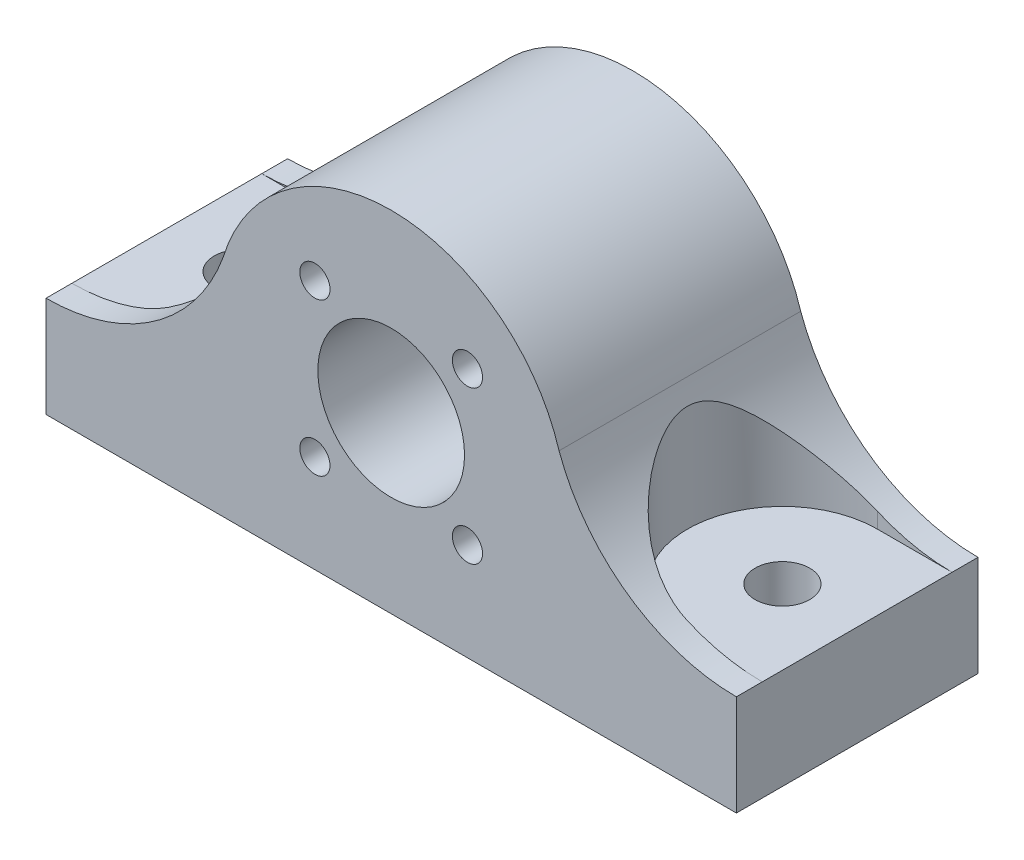
ISO-10303-21;
HEADER;
FILE_DESCRIPTION(('STEP AP214'),'2;1');
FILE_NAME('part.step','',(''),(''),'','','');
FILE_SCHEMA(('AUTOMOTIVE_DESIGN { 1 0 10303 214 1 1 1 1 }'));
ENDSEC;
DATA;
#1=APPLICATION_CONTEXT('core data for automotive mechanical design processes');
#2=APPLICATION_PROTOCOL_DEFINITION('international standard','automotive_design',2000,#1);
#3=PRODUCT_CONTEXT('',#1,'mechanical');
#4=PRODUCT('Part','Part','',(#3));
#5=PRODUCT_RELATED_PRODUCT_CATEGORY('part','',(#4));
#6=PRODUCT_DEFINITION_FORMATION('','',#4);
#7=PRODUCT_DEFINITION_CONTEXT('part definition',#1,'design');
#8=PRODUCT_DEFINITION('design','',#6,#7);
#9=PRODUCT_DEFINITION_SHAPE('','',#8);
#10=(LENGTH_UNIT() NAMED_UNIT(*) SI_UNIT(.MILLI.,.METRE.));
#11=(NAMED_UNIT(*) PLANE_ANGLE_UNIT() SI_UNIT($,.RADIAN.));
#12=(NAMED_UNIT(*) SI_UNIT($,.STERADIAN.) SOLID_ANGLE_UNIT());
#13=UNCERTAINTY_MEASURE_WITH_UNIT(LENGTH_MEASURE(1.E-05),#10,'distance_accuracy_value','');
#14=(GEOMETRIC_REPRESENTATION_CONTEXT(3) GLOBAL_UNCERTAINTY_ASSIGNED_CONTEXT((#13)) GLOBAL_UNIT_ASSIGNED_CONTEXT((#10,
#11,#12)) REPRESENTATION_CONTEXT('',''));
#15=CARTESIAN_POINT('',(0.,0.,0.));
#16=DIRECTION('',(0.,0.,1.));
#17=DIRECTION('',(1.,0.,0.));
#18=AXIS2_PLACEMENT_3D('',#15,#16,#17);
#19=CARTESIAN_POINT('',(24.,13.1098300768287,16.8));
#20=DIRECTION('',(0.,0.,-1.));
#21=DIRECTION('',(-1.,0.,0.));
#22=AXIS2_PLACEMENT_3D('',#19,#20,#21);
#23=CYLINDRICAL_SURFACE('',#22,13.1098300768287);
#24=CARTESIAN_POINT('',(24.,13.1098300768287,1.8));
#25=DIRECTION('',(0.,0.,1.));
#26=DIRECTION('',(1.,0.,0.));
#27=AXIS2_PLACEMENT_3D('',#24,#25,#26);
#28=CIRCLE('',#27,13.1098300768287);
#29=CARTESIAN_POINT('',(24.,0.,1.8));
#30=VERTEX_POINT('',#29);
#31=CARTESIAN_POINT('',(18.8,1.07539429265824,1.8));
#32=VERTEX_POINT('',#31);
#33=EDGE_CURVE('E11',#30,#32,#28,.F.);
#34=ORIENTED_EDGE('',*,*,#33,.F.);
#35=DIRECTION('',(0.,0.,-1.));
#36=VECTOR('',#35,1.);
#37=CARTESIAN_POINT('',(24.,0.,16.8));
#38=LINE('',#37,#36);
#39=CARTESIAN_POINT('',(24.,0.,0.));
#40=VERTEX_POINT('',#39);
#41=EDGE_CURVE('E143',#30,#40,#38,.T.);
#42=ORIENTED_EDGE('',*,*,#41,.T.);
#43=CARTESIAN_POINT('',(24.,13.1098300768287,0.));
#44=DIRECTION('',(0.,0.,-1.));
#45=DIRECTION('',(-1.,0.,0.));
#46=AXIS2_PLACEMENT_3D('',#43,#44,#45);
#47=CIRCLE('',#46,13.1098300768287);
#48=CARTESIAN_POINT('',(11.6720820764763,8.65,0.));
#49=VERTEX_POINT('',#48);
#50=EDGE_CURVE('E336',#40,#49,#47,.T.);
#51=ORIENTED_EDGE('',*,*,#50,.T.);
#52=DIRECTION('',(0.,0.,-1.));
#53=VECTOR('',#52,1.);
#54=CARTESIAN_POINT('',(11.6720820764763,8.65,16.8));
#55=LINE('',#54,#53);
#56=CARTESIAN_POINT('',(11.6720820764763,8.65,16.8));
#57=VERTEX_POINT('',#56);
#58=EDGE_CURVE('E171',#57,#49,#55,.T.);
#59=ORIENTED_EDGE('',*,*,#58,.F.);
#60=CARTESIAN_POINT('',(24.,13.1098300768287,16.8));
#61=DIRECTION('',(0.,0.,-1.));
#62=DIRECTION('',(-1.,0.,0.));
#63=AXIS2_PLACEMENT_3D('',#60,#61,#62);
#64=CIRCLE('',#63,13.1098300768287);
#65=CARTESIAN_POINT('',(24.,0.,16.8));
#66=VERTEX_POINT('',#65);
#67=EDGE_CURVE('E339',#66,#57,#64,.T.);
#68=ORIENTED_EDGE('',*,*,#67,.F.);
#69=CARTESIAN_POINT('',(24.,0.,15.));
#70=VERTEX_POINT('',#69);
#71=EDGE_CURVE('E151',#66,#70,#38,.T.);
#72=ORIENTED_EDGE('',*,*,#71,.T.);
#73=CARTESIAN_POINT('',(24.,13.1098300768287,15.));
#74=DIRECTION('',(0.,0.,-1.));
#75=DIRECTION('',(-1.,0.,0.));
#76=AXIS2_PLACEMENT_3D('',#73,#74,#75);
#77=CIRCLE('',#76,13.1098300768287);
#78=CARTESIAN_POINT('',(18.8,1.07539429265824,15.));
#79=VERTEX_POINT('',#78);
#80=EDGE_CURVE('E258',#79,#70,#77,.F.);
#81=ORIENTED_EDGE('',*,*,#80,.F.);
#82=CARTESIAN_POINT('',(24.,0.,4.33551971341969));
#83=CARTESIAN_POINT('',(23.8919678579725,-1.54419120571519E-06,4.19727136892321));
#84=CARTESIAN_POINT('',(23.7783821198537,0.00133496363836336,4.0633464538159));
#85=CARTESIAN_POINT('',(23.5409350716157,0.00750205246568845,3.80497546751053));
#86=CARTESIAN_POINT('',(23.4170715750358,0.0123333786368567,3.68053142410222));
#87=CARTESIAN_POINT('',(23.1599009828539,0.0263112967807585,3.44197077370692));
#88=CARTESIAN_POINT('',(23.0265904905904,0.035459447623843,3.32785791522285));
#89=CARTESIAN_POINT('',(22.7515968409265,0.0588466022616071,3.11080761608302));
#90=CARTESIAN_POINT('',(22.6099144882146,0.0730851174417469,3.00786910405855));
#91=CARTESIAN_POINT('',(22.3189880459794,0.107394192566268,2.81364339589038));
#92=CARTESIAN_POINT('',(22.1697280914674,0.127477443356168,2.72238218247385));
#93=CARTESIAN_POINT('',(21.8652115087728,0.174064055512228,2.55236066892208));
#94=CARTESIAN_POINT('',(21.7099550229094,0.200567264588346,2.47360007232876));
#95=CARTESIAN_POINT('',(21.3949908563303,0.260423983901539,2.32908477377368));
#96=CARTESIAN_POINT('',(21.2352882333197,0.293769964899572,2.26331593151566));
#97=CARTESIAN_POINT('',(20.912706732767,0.367630943318746,2.14492302379764));
#98=CARTESIAN_POINT('',(20.7498279517736,0.408145723124559,2.09229855944513));
#99=CARTESIAN_POINT('',(20.426927825459,0.49523628311991,2.00152811505207));
#100=CARTESIAN_POINT('',(20.2669541958683,0.541610555855526,1.96301794539534));
#101=CARTESIAN_POINT('',(19.9466623814907,0.641220490085528,1.89831873930515));
#102=CARTESIAN_POINT('',(19.7863442036258,0.694456014980988,1.8721294576265));
#103=CARTESIAN_POINT('',(19.466513779999,0.807637811797313,1.83176194008686));
#104=CARTESIAN_POINT('',(19.3070018337271,0.867586409777519,1.81758788213396));
#105=CARTESIAN_POINT('',(18.9898727453009,0.993914214771304,1.80082018715825));
#106=CARTESIAN_POINT('',(18.8322563313994,1.06029580983596,1.79823086756499));
#107=CARTESIAN_POINT('',(18.5129129951867,1.20221049391793,1.80422729585653));
#108=CARTESIAN_POINT('',(18.3513190266952,1.27802058255163,1.81331975096274));
#109=CARTESIAN_POINT('',(18.032144125916,1.43575413240055,1.84285895888905));
#110=CARTESIAN_POINT('',(17.8745648103248,1.51768000582941,1.86331021259557));
#111=CARTESIAN_POINT('',(17.5642091599574,1.68706804275672,1.91481964206346));
#112=CARTESIAN_POINT('',(17.4114326525692,1.77453000694782,1.94587743615061));
#113=CARTESIAN_POINT('',(17.1112131047088,1.95443204289707,2.01785009601203));
#114=CARTESIAN_POINT('',(16.963771138137,2.04687310778242,2.0587669339582));
#115=CARTESIAN_POINT('',(16.6107327185307,2.27800578907204,2.16984234650978));
#116=CARTESIAN_POINT('',(16.4082314214901,2.41908315275578,2.24493261105059));
#117=CARTESIAN_POINT('',(16.0159883683902,2.70873854478921,2.41211473145636));
#118=CARTESIAN_POINT('',(15.8262514537032,2.85731938212334,2.50421298919359));
#119=CARTESIAN_POINT('',(15.4595901994709,3.16067030632686,2.70391897380273));
#120=CARTESIAN_POINT('',(15.2826948977154,3.315453262745,2.81156030026097));
#121=CARTESIAN_POINT('',(14.9423653546212,3.62929844647699,3.04082517795332));
#122=CARTESIAN_POINT('',(14.7789294853709,3.78836015318171,3.16244703397366));
#123=CARTESIAN_POINT('',(14.462764069721,4.11200598838441,3.42096223270564));
#124=CARTESIAN_POINT('',(14.3102722719071,4.2766380456356,3.55808580474619));
#125=CARTESIAN_POINT('',(14.0191652553494,4.60694554556832,3.84528333918408));
#126=CARTESIAN_POINT('',(13.8805529601696,4.77262120029323,3.99536001766645));
#127=CARTESIAN_POINT('',(13.6175345153183,5.10255481773947,4.30808989117175));
#128=CARTESIAN_POINT('',(13.4931005646782,5.26681494999416,4.47071738774469));
#129=CARTESIAN_POINT('',(13.2583865058315,5.59148859362617,4.80932468585732));
#130=CARTESIAN_POINT('',(13.1480991873502,5.75190403039788,4.98529761211785));
#131=CARTESIAN_POINT('',(12.9396009949646,6.06908552921575,5.35660801400765));
#132=CARTESIAN_POINT('',(12.8417596294292,6.225660980636,5.55231881864511));
#133=CARTESIAN_POINT('',(12.6627790991701,6.52459678331459,5.96186841163216));
#134=CARTESIAN_POINT('',(12.581641630024,6.66695569072676,6.17570903719461));
#135=CARTESIAN_POINT('',(12.4509540851328,6.9047986515647,6.58672697198489));
#136=CARTESIAN_POINT('',(12.3983863306009,7.00413950765111,6.78065518777775));
#137=CARTESIAN_POINT('',(12.3097775865062,7.17554763702746,7.18375596870057));
#138=CARTESIAN_POINT('',(12.273688832287,7.24769362763432,7.39288241254132));
#139=CARTESIAN_POINT('',(12.2281167756389,7.33987234591703,7.76998485317434));
#140=CARTESIAN_POINT('',(12.214255170523,7.36839143320737,7.93530582038945));
#141=CARTESIAN_POINT('',(12.1991973493075,7.39939741262399,8.26890418078606));
#142=CARTESIAN_POINT('',(12.1979881710609,7.40191094686658,8.43717837132612));
#143=CARTESIAN_POINT('',(12.2083357562146,7.38057175603785,8.77136983438056));
#144=CARTESIAN_POINT('',(12.2198774386231,7.35675017861418,8.93728965664949));
#145=CARTESIAN_POINT('',(12.2545978269363,7.28619781377521,9.26292487433375));
#146=CARTESIAN_POINT('',(12.2777935107874,7.23943360509798,9.42263085040844));
#147=CARTESIAN_POINT('',(12.3507105959016,7.09557576425532,9.82458553132353));
#148=CARTESIAN_POINT('',(12.4080121368051,6.98503783470272,10.0605979130179));
#149=CARTESIAN_POINT('',(12.5087957869682,6.79912737652016,10.3986711415181));
#150=CARTESIAN_POINT('',(12.5449583930853,6.7336399889594,10.5089298815429));
#151=CARTESIAN_POINT('',(12.6218436305865,6.59743417695687,10.7245324333388));
#152=CARTESIAN_POINT('',(12.6625652797075,6.52671688042909,10.8298772969207));
#153=CARTESIAN_POINT('',(12.7857728623214,6.31764822660199,11.1263589045584));
#154=CARTESIAN_POINT('',(12.8735854045131,6.1743353756479,11.3117765333973));
#155=CARTESIAN_POINT('',(13.0627887123436,5.87962706703347,11.6688246678923));
#156=CARTESIAN_POINT('',(13.1641907291987,5.72822497513586,11.8404435586538));
#157=CARTESIAN_POINT('',(13.3800614839052,5.42088556827216,12.1713829015469));
#158=CARTESIAN_POINT('',(13.4945464523393,5.26494280280095,12.3306876572206));
#159=CARTESIAN_POINT('',(13.7361759294436,4.95135252396875,12.6374260594472));
#160=CARTESIAN_POINT('',(13.8633167147388,4.7937055240935,12.7848631745396));
#161=CARTESIAN_POINT('',(14.1410718780176,4.46581357816768,13.0795999336553));
#162=CARTESIAN_POINT('',(14.2927541818074,4.29558587775522,13.2259148851044));
#163=CARTESIAN_POINT('',(14.6109186774136,3.95741436602203,13.5045379878621));
#164=CARTESIAN_POINT('',(14.7774034718958,3.78947096234946,13.6368436669783));
#165=CARTESIAN_POINT('',(15.1248880447335,3.45801150016563,13.886275479253));
#166=CARTESIAN_POINT('',(15.3058652194449,3.29448905939364,14.0034245332972));
#167=CARTESIAN_POINT('',(15.6824016724741,2.97344146368716,14.2213286509662));
#168=CARTESIAN_POINT('',(15.8779568686112,2.8159146483648,14.3220882790466));
#169=CARTESIAN_POINT('',(16.2414372931092,2.54038818925504,14.4864531231355));
#170=CARTESIAN_POINT('',(16.4067410331015,2.42093779786057,14.5534350972045));
#171=CARTESIAN_POINT('',(16.7458962076883,2.18792881002065,14.6747974598849));
#172=CARTESIAN_POINT('',(16.9197459287343,2.07436904175997,14.7291803623346));
#173=CARTESIAN_POINT('',(17.2752799502428,1.85418822049595,14.8240996571317));
#174=CARTESIAN_POINT('',(17.4569584921594,1.74756220742406,14.8646460376437));
#175=CARTESIAN_POINT('',(17.8273690627669,1.54215566871015,14.9306477694618));
#176=CARTESIAN_POINT('',(18.0161000692684,1.44337401253753,14.9561052988075));
#177=CARTESIAN_POINT('',(18.3708163874544,1.26867299165842,14.9880663511403));
#178=CARTESIAN_POINT('',(18.5360020238465,1.19153995509184,14.9968284198118));
#179=CARTESIAN_POINT('',(18.8695991342095,1.04418199491221,15.0017400288873));
#180=CARTESIAN_POINT('',(19.0380100168163,0.973955819111043,14.9978918598379));
#181=CARTESIAN_POINT('',(19.3768457346043,0.84087718266649,14.9769330008779));
#182=CARTESIAN_POINT('',(19.5472697651762,0.778021878957732,14.9598274440581));
#183=CARTESIAN_POINT('',(19.8888496624852,0.659981184908422,14.911846719861));
#184=CARTESIAN_POINT('',(20.0600055366552,0.604795872660494,14.8809714122995));
#185=CARTESIAN_POINT('',(20.4021755025314,0.50208139446981,14.8049868402637));
#186=CARTESIAN_POINT('',(20.5731867940951,0.454580922638591,14.759826008898));
#187=CARTESIAN_POINT('',(20.9128345490924,0.367467913570072,14.6551982923236));
#188=CARTESIAN_POINT('',(21.0814709716393,0.327855511983147,14.5957311611296));
#189=CARTESIAN_POINT('',(21.4148100289309,0.256289125899758,14.4625897830849));
#190=CARTESIAN_POINT('',(21.5795107408356,0.224338818616978,14.3889087451422));
#191=CARTESIAN_POINT('',(21.9032857481589,0.167711089132467,14.2277196009515));
#192=CARTESIAN_POINT('',(22.0623604790495,0.143033102936957,14.1402125677665));
#193=CARTESIAN_POINT('',(22.3633510128825,0.101732612304182,13.9580084830531));
#194=CARTESIAN_POINT('',(22.5057118595631,0.0846933171075692,13.8641387791883));
#195=CARTESIAN_POINT('',(22.7830794496132,0.0558578408058795,13.6653760376127));
#196=CARTESIAN_POINT('',(22.9180861906489,0.044061661364614,13.5604829964038));
#197=CARTESIAN_POINT('',(23.1795181814501,0.025044588624008,13.3405426933035));
#198=CARTESIAN_POINT('',(23.3059566478579,0.0178164986491267,13.2255117304001));
#199=CARTESIAN_POINT('',(23.5495558413798,0.00717383619441023,12.9859434482705));
#200=CARTESIAN_POINT('',(23.6667213801893,0.00375727370962314,12.8614111260411));
#201=CARTESIAN_POINT('',(23.8169061038591,0.00122333708919264,12.6888247007715));
#202=CARTESIAN_POINT('',(23.8543754616406,0.000756901480981962,12.6446024679814));
#203=CARTESIAN_POINT('',(23.9280944038036,0.000145477956769293,12.5552372596187));
#204=CARTESIAN_POINT('',(23.9643453610683,1.15422993604912E-07,12.5100954191735));
#205=CARTESIAN_POINT('',(24.,0.,12.4644802865803));
#206=B_SPLINE_CURVE_WITH_KNOTS('',3,(#82,#83,#84,#85,#86,#87,#88,#89,#90,#91,#92,#93,#94,#95,
#96,#97,#98,#99,#100,#101,#102,#103,#104,#105,#106,#107,#108,#109,#110,#111,#112,#113,#114,#115,
#116,#117,#118,#119,#120,#121,#122,#123,#124,#125,#126,#127,#128,#129,#130,#131,#132,#133,#134,
#135,#136,#137,#138,#139,#140,#141,#142,#143,#144,#145,#146,#147,#148,#149,#150,#151,#152,#153,
#154,#155,#156,#157,#158,#159,#160,#161,#162,#163,#164,#165,#166,#167,#168,#169,#170,#171,#172,
#173,#174,#175,#176,#177,#178,#179,#180,#181,#182,#183,#184,#185,#186,#187,#188,#189,#190,#191,
#192,#193,#194,#195,#196,#197,#198,#199,#200,#201,#202,#203,#204,#205),.UNSPECIFIED.,.F.,.F.,(4,
2,2,2,2,2,2,2,2,2,2,2,2,2,2,2,2,2,2,2,2,2,2,2,2,2,2,2,2,2,2,2,2,2,2,2,2,2,2,2,2,2,2,2,2,2,2,2,2,
2,2,2,2,2,2,2,2,2,2,2,2,4),(0.,0.526232805638167,1.05257784896305,1.5791131090298,
2.10559784152694,2.63323438540227,3.16085841425489,3.68790497117736,4.21493553187203,
4.72720696830762,5.23946820763621,5.75190749637536,6.26453774638274,6.8001728084799,
7.336020265779,7.87184844274664,8.40778389419974,9.18056261735872,9.95363281239707,
10.7283998982175,11.5030731382977,12.2913189884279,13.0797305261018,13.8665685250894,
14.6530038802843,15.4590405268195,16.2651589521531,16.9356584115313,17.6042018844253,
18.1069655130884,18.6092140204231,19.110869132178,19.6132572005721,20.4089074571561,
20.8084974267909,21.2080014683302,21.9576072361315,22.7078375085944,23.4590088257556,
24.2099597958408,25.0219320054885,25.8340472645263,26.644919663203,27.4555658457998,
28.0989943293821,28.7422943216752,29.3851289480353,30.0278707601383,30.5748677115066,
31.1217653108536,31.6684512641687,32.2151427832021,32.7638306740213,33.312527999758,
33.8614881332048,34.4104056816742,34.9239317043016,35.4374578898873,35.9501730241847,
36.4626203435813,36.6364959228367,36.8101685222338),.UNSPECIFIED.);
#207=EDGE_CURVE('E41',#32,#79,#206,.T.);
#208=ORIENTED_EDGE('',*,*,#207,.F.);
#209=EDGE_LOOP('',(#34,#42,#51,#59,#68,#72,#81,#208));
#210=FACE_BOUND('',#209,.T.);
#211=ADVANCED_FACE('F33',(#210),#23,.F.);
#212=CARTESIAN_POINT('',(-24.,13.1098300768287,16.8));
#213=DIRECTION('',(0.,0.,-1.));
#214=DIRECTION('',(-1.,0.,0.));
#215=AXIS2_PLACEMENT_3D('',#212,#213,#214);
#216=CYLINDRICAL_SURFACE('',#215,13.1098300768287);
#217=CARTESIAN_POINT('',(-24.,13.1098300768287,1.8));
#218=DIRECTION('',(0.,0.,1.));
#219=DIRECTION('',(1.,0.,0.));
#220=AXIS2_PLACEMENT_3D('',#217,#218,#219);
#221=CIRCLE('',#220,13.1098300768287);
#222=CARTESIAN_POINT('',(-18.8,1.07539429265824,1.8));
#223=VERTEX_POINT('',#222);
#224=CARTESIAN_POINT('',(-24.,0.,1.8));
#225=VERTEX_POINT('',#224);
#226=EDGE_CURVE('E253',#223,#225,#221,.F.);
#227=ORIENTED_EDGE('',*,*,#226,.F.);
#228=CARTESIAN_POINT('',(-24.,0.,12.4644802865803));
#229=CARTESIAN_POINT('',(-23.8919678579725,-1.54419120449682E-06,12.6027286310768));
#230=CARTESIAN_POINT('',(-23.7783821198537,0.00133496363836513,12.7366535461841));
#231=CARTESIAN_POINT('',(-23.5409350716157,0.00750205246569051,12.9950245324895));
#232=CARTESIAN_POINT('',(-23.4170715750358,0.0123333786368585,13.1194685758978));
#233=CARTESIAN_POINT('',(-23.1599009828539,0.0263112967807594,13.3580292262931));
#234=CARTESIAN_POINT('',(-23.0265904905904,0.0354594476238431,13.4721420847772));
#235=CARTESIAN_POINT('',(-22.7515968409265,0.0588466022616079,13.689192383917));
#236=CARTESIAN_POINT('',(-22.6099144882146,0.0730851174417491,13.7921308959415));
#237=CARTESIAN_POINT('',(-22.3189880459794,0.107394192566271,13.9863566041096));
#238=CARTESIAN_POINT('',(-22.1697280914674,0.127477443356171,14.0776178175262));
#239=CARTESIAN_POINT('',(-21.8652115087728,0.17406405551223,14.2476393310779));
#240=CARTESIAN_POINT('',(-21.7099550229094,0.200567264588348,14.3263999276712));
#241=CARTESIAN_POINT('',(-21.3949908563303,0.260423983901539,14.4709152262263));
#242=CARTESIAN_POINT('',(-21.2352882333197,0.293769964899572,14.5366840684843));
#243=CARTESIAN_POINT('',(-20.912706732767,0.367630943318745,14.6550769762024));
#244=CARTESIAN_POINT('',(-20.7498279517736,0.408145723124558,14.7077014405549));
#245=CARTESIAN_POINT('',(-20.426927825459,0.495236283119909,14.7984718849479));
#246=CARTESIAN_POINT('',(-20.2669541958683,0.541610555855525,14.8369820546047));
#247=CARTESIAN_POINT('',(-19.9466623814907,0.641220490085528,14.9016812606949));
#248=CARTESIAN_POINT('',(-19.7863442036258,0.694456014980988,14.9278705423735));
#249=CARTESIAN_POINT('',(-19.466513779999,0.807637811797314,14.9682380599131));
#250=CARTESIAN_POINT('',(-19.3070018337271,0.86758640977752,14.9824121178661));
#251=CARTESIAN_POINT('',(-18.9898727453009,0.993914214771306,14.9991798128418));
#252=CARTESIAN_POINT('',(-18.8322563313994,1.06029580983596,15.001769132435));
#253=CARTESIAN_POINT('',(-18.5129129951867,1.20221049391793,14.9957727041435));
#254=CARTESIAN_POINT('',(-18.3513190266952,1.27802058255163,14.9866802490373));
#255=CARTESIAN_POINT('',(-18.032144125916,1.43575413240055,14.957141041111));
#256=CARTESIAN_POINT('',(-17.8745648103248,1.51768000582941,14.9366897874044));
#257=CARTESIAN_POINT('',(-17.5642091599574,1.68706804275673,14.8851803579365));
#258=CARTESIAN_POINT('',(-17.4114326525692,1.77453000694782,14.8541225638494));
#259=CARTESIAN_POINT('',(-17.1112131047088,1.95443204289707,14.782149903988));
#260=CARTESIAN_POINT('',(-16.963771138137,2.04687310778242,14.7412330660418));
#261=CARTESIAN_POINT('',(-16.6107327185307,2.27800578907204,14.6301576534902));
#262=CARTESIAN_POINT('',(-16.4082314214901,2.41908315275578,14.5550673889494));
#263=CARTESIAN_POINT('',(-16.0159883683902,2.70873854478921,14.3878852685437));
#264=CARTESIAN_POINT('',(-15.8262514537032,2.85731938212334,14.2957870108064));
#265=CARTESIAN_POINT('',(-15.4595901994709,3.16067030632686,14.0960810261973));
#266=CARTESIAN_POINT('',(-15.2826948977154,3.315453262745,13.988439699739));
#267=CARTESIAN_POINT('',(-14.9423653546212,3.62929844647699,13.7591748220467));
#268=CARTESIAN_POINT('',(-14.7789294853709,3.78836015318171,13.6375529660263));
#269=CARTESIAN_POINT('',(-14.462764069721,4.11200598838441,13.3790377672944));
#270=CARTESIAN_POINT('',(-14.3102722719071,4.2766380456356,13.2419141952538));
#271=CARTESIAN_POINT('',(-14.0191652553495,4.60694554556832,12.9547166608159));
#272=CARTESIAN_POINT('',(-13.8805529601696,4.77262120029323,12.8046399823336));
#273=CARTESIAN_POINT('',(-13.6175345153183,5.10255481773947,12.4919101088283));
#274=CARTESIAN_POINT('',(-13.4931005646782,5.26681494999416,12.3292826122553));
#275=CARTESIAN_POINT('',(-13.2583865058315,5.59148859362617,11.9906753141427));
#276=CARTESIAN_POINT('',(-13.1480991873503,5.75190403039788,11.8147023878822));
#277=CARTESIAN_POINT('',(-12.9396009949646,6.06908552921575,11.4433919859924));
#278=CARTESIAN_POINT('',(-12.8417596294292,6.225660980636,11.2476811813549));
#279=CARTESIAN_POINT('',(-12.6627790991701,6.52459678331459,10.8381315883678));
#280=CARTESIAN_POINT('',(-12.581641630024,6.66695569072676,10.6242909628054));
#281=CARTESIAN_POINT('',(-12.4509540851328,6.90479865156469,10.2132730280151));
#282=CARTESIAN_POINT('',(-12.3983863306009,7.00413950765111,10.0193448122223));
#283=CARTESIAN_POINT('',(-12.3097775865062,7.17554763702746,9.61624403129943));
#284=CARTESIAN_POINT('',(-12.273688832287,7.24769362763432,9.40711758745868));
#285=CARTESIAN_POINT('',(-12.2281167756389,7.33987234591703,9.03001514682566));
#286=CARTESIAN_POINT('',(-12.214255170523,7.36839143320736,8.86469417961056));
#287=CARTESIAN_POINT('',(-12.1991973493075,7.39939741262398,8.53109581921395));
#288=CARTESIAN_POINT('',(-12.1979881710609,7.40191094686658,8.36282162867388));
#289=CARTESIAN_POINT('',(-12.2083357562146,7.38057175603785,8.02863016561945));
#290=CARTESIAN_POINT('',(-12.2198774386231,7.35675017861417,7.86271034335052));
#291=CARTESIAN_POINT('',(-12.2545978269363,7.28619781377521,7.53707512566626));
#292=CARTESIAN_POINT('',(-12.2777935107874,7.23943360509799,7.37736914959156));
#293=CARTESIAN_POINT('',(-12.3507105959016,7.09557576425532,6.97541446867648));
#294=CARTESIAN_POINT('',(-12.4080121368051,6.98503783470272,6.73940208698212));
#295=CARTESIAN_POINT('',(-12.5087957869682,6.79912737652016,6.40132885848187));
#296=CARTESIAN_POINT('',(-12.5449583930853,6.7336399889594,6.2910701184571));
#297=CARTESIAN_POINT('',(-12.6218436305865,6.59743417695687,6.07546756666123));
#298=CARTESIAN_POINT('',(-12.6625652797075,6.52671688042909,5.97012270307929));
#299=CARTESIAN_POINT('',(-12.7857728623214,6.31764822660199,5.67364109544156));
#300=CARTESIAN_POINT('',(-12.8735854045131,6.1743353756479,5.48822346660275));
#301=CARTESIAN_POINT('',(-13.0627887123436,5.87962706703347,5.13117533210769));
#302=CARTESIAN_POINT('',(-13.1641907291987,5.72822497513586,4.95955644134617));
#303=CARTESIAN_POINT('',(-13.3800614839052,5.42088556827216,4.62861709845306));
#304=CARTESIAN_POINT('',(-13.4945464523393,5.26494280280095,4.46931234277937));
#305=CARTESIAN_POINT('',(-13.7361759294436,4.95135252396875,4.16257394055278));
#306=CARTESIAN_POINT('',(-13.8633167147388,4.7937055240935,4.01513682546045));
#307=CARTESIAN_POINT('',(-14.1410718780176,4.46581357816767,3.72040006634468));
#308=CARTESIAN_POINT('',(-14.2927541818074,4.29558587775522,3.57408511489565));
#309=CARTESIAN_POINT('',(-14.6109186774136,3.95741436602203,3.29546201213793));
#310=CARTESIAN_POINT('',(-14.7774034718958,3.78947096234946,3.16315633302173));
#311=CARTESIAN_POINT('',(-15.1248880447335,3.45801150016563,2.913724520747));
#312=CARTESIAN_POINT('',(-15.3058652194449,3.29448905939364,2.79657546670278));
#313=CARTESIAN_POINT('',(-15.6824016724741,2.97344146368715,2.57867134903378));
#314=CARTESIAN_POINT('',(-15.8779568686112,2.81591464836479,2.47791172095344));
#315=CARTESIAN_POINT('',(-16.2414372931093,2.54038818925504,2.31354687686452));
#316=CARTESIAN_POINT('',(-16.4067410331015,2.42093779786057,2.24656490279548));
#317=CARTESIAN_POINT('',(-16.7458962076883,2.18792881002065,2.12520254011512));
#318=CARTESIAN_POINT('',(-16.9197459287343,2.07436904175996,2.07081963766539));
#319=CARTESIAN_POINT('',(-17.2752799502428,1.85418822049595,1.97590034286828));
#320=CARTESIAN_POINT('',(-17.4569584921594,1.74756220742406,1.93535396235629));
#321=CARTESIAN_POINT('',(-17.8273690627669,1.54215566871015,1.86935223053824));
#322=CARTESIAN_POINT('',(-18.0161000692684,1.44337401253753,1.84389470119251));
#323=CARTESIAN_POINT('',(-18.3708163874544,1.26867299165842,1.81193364885969));
#324=CARTESIAN_POINT('',(-18.5360020238465,1.19153995509184,1.80317158018819));
#325=CARTESIAN_POINT('',(-18.8695991342095,1.04418199491221,1.79825997111273));
#326=CARTESIAN_POINT('',(-19.0380100168163,0.973955819111045,1.80210814016207));
#327=CARTESIAN_POINT('',(-19.3768457346043,0.840877182666493,1.82306699912213));
#328=CARTESIAN_POINT('',(-19.5472697651762,0.778021878957736,1.84017255594194));
#329=CARTESIAN_POINT('',(-19.8888496624852,0.659981184908424,1.88815328013897));
#330=CARTESIAN_POINT('',(-20.0600055366552,0.604795872660493,1.91902858770052));
#331=CARTESIAN_POINT('',(-20.4021755025314,0.502081394469806,1.99501315973626));
#332=CARTESIAN_POINT('',(-20.5731867940951,0.454580922638589,2.04017399110197));
#333=CARTESIAN_POINT('',(-20.9128345490924,0.367467913570072,2.14480170767643));
#334=CARTESIAN_POINT('',(-21.0814709716393,0.327855511983148,2.20426883887039));
#335=CARTESIAN_POINT('',(-21.4148100289309,0.256289125899759,2.33741021691507));
#336=CARTESIAN_POINT('',(-21.5795107408356,0.224338818616979,2.41109125485783));
#337=CARTESIAN_POINT('',(-21.9032857481589,0.167711089132467,2.57228039904854));
#338=CARTESIAN_POINT('',(-22.0623604790495,0.143033102936957,2.6597874322335));
#339=CARTESIAN_POINT('',(-22.3633510128825,0.101732612304182,2.84199151694694));
#340=CARTESIAN_POINT('',(-22.5057118595631,0.0846933171075707,2.9358612208117));
#341=CARTESIAN_POINT('',(-22.7830794496132,0.0558578408058813,3.13462396238733));
#342=CARTESIAN_POINT('',(-22.9180861906489,0.0440616613646148,3.23951700359623));
#343=CARTESIAN_POINT('',(-23.1795181814501,0.0250445886240085,3.45945730669648));
#344=CARTESIAN_POINT('',(-23.3059566478579,0.017816498649128,3.57448826959992));
#345=CARTESIAN_POINT('',(-23.5495558413798,0.00717383619440966,3.81405655172945));
#346=CARTESIAN_POINT('',(-23.6667213801893,0.00375727370961992,3.9385888739589));
#347=CARTESIAN_POINT('',(-23.8169061038591,0.00122333708919366,4.1111752992285));
#348=CARTESIAN_POINT('',(-23.8543754616406,0.000756901480984722,4.15539753201859));
#349=CARTESIAN_POINT('',(-23.9280944038036,0.000145477956773226,4.24476274038133));
#350=CARTESIAN_POINT('',(-23.9643453610682,1.15422996970621E-07,4.28990458082648));
#351=CARTESIAN_POINT('',(-24.,0.,4.33551971341968));
#352=B_SPLINE_CURVE_WITH_KNOTS('',3,(#228,#229,#230,#231,#232,#233,#234,#235,#236,#237,#238,
#239,#240,#241,#242,#243,#244,#245,#246,#247,#248,#249,#250,#251,#252,#253,#254,#255,#256,#257,
#258,#259,#260,#261,#262,#263,#264,#265,#266,#267,#268,#269,#270,#271,#272,#273,#274,#275,#276,
#277,#278,#279,#280,#281,#282,#283,#284,#285,#286,#287,#288,#289,#290,#291,#292,#293,#294,#295,
#296,#297,#298,#299,#300,#301,#302,#303,#304,#305,#306,#307,#308,#309,#310,#311,#312,#313,#314,
#315,#316,#317,#318,#319,#320,#321,#322,#323,#324,#325,#326,#327,#328,#329,#330,#331,#332,#333,
#334,#335,#336,#337,#338,#339,#340,#341,#342,#343,#344,#345,#346,#347,#348,#349,#350,#351),
.UNSPECIFIED.,.F.,.F.,(4,2,2,2,2,2,2,2,2,2,2,2,2,2,2,2,2,2,2,2,2,2,2,2,2,2,2,2,2,2,2,2,2,2,2,2,
2,2,2,2,2,2,2,2,2,2,2,2,2,2,2,2,2,2,2,2,2,2,2,2,2,4),(0.,0.52623280563817,1.05257784896305,
1.57911310902979,2.10559784152694,2.63323438540227,3.16085841425488,3.68790497117735,
4.21493553187202,4.72720696830761,5.2394682076362,5.75190749637536,6.26453774638274,
6.80017280847989,7.33602026577899,7.87184844274663,8.40778389419972,9.18056261735871,
9.95363281239706,10.7283998982175,11.5030731382977,12.2913189884279,13.0797305261018,
13.8665685250894,14.6530038802842,15.4590405268195,16.265158952153,16.9356584115313,
17.6042018844253,18.1069655130884,18.6092140204231,19.110869132178,19.6132572005721,
20.408907457156,20.8084974267909,21.2080014683301,21.9576072361315,22.7078375085944,
23.4590088257555,24.2099597958408,25.0219320054885,25.8340472645263,26.644919663203,
27.4555658457997,28.0989943293821,28.7422943216752,29.3851289480353,30.0278707601383,
30.5748677115065,31.1217653108536,31.6684512641686,32.2151427832021,32.7638306740213,
33.312527999758,33.8614881332048,34.4104056816742,34.9239317043016,35.4374578898873,
35.9501730241846,36.4626203435813,36.6364959228367,36.8101685222337),.UNSPECIFIED.);
#353=CARTESIAN_POINT('',(-18.8,1.07539429265824,15.));
#354=VERTEX_POINT('',#353);
#355=EDGE_CURVE('E174',#354,#223,#352,.T.);
#356=ORIENTED_EDGE('',*,*,#355,.F.);
#357=CARTESIAN_POINT('',(-24.,13.1098300768287,15.));
#358=DIRECTION('',(0.,0.,-1.));
#359=DIRECTION('',(-1.,0.,0.));
#360=AXIS2_PLACEMENT_3D('',#357,#358,#359);
#361=CIRCLE('',#360,13.1098300768287);
#362=CARTESIAN_POINT('',(-24.,0.,15.));
#363=VERTEX_POINT('',#362);
#364=EDGE_CURVE('E181',#363,#354,#361,.F.);
#365=ORIENTED_EDGE('',*,*,#364,.F.);
#366=DIRECTION('',(0.,0.,-1.));
#367=VECTOR('',#366,1.);
#368=CARTESIAN_POINT('',(-24.,0.,16.8));
#369=LINE('',#368,#367);
#370=CARTESIAN_POINT('',(-24.,0.,16.8));
#371=VERTEX_POINT('',#370);
#372=EDGE_CURVE('E165',#371,#363,#369,.T.);
#373=ORIENTED_EDGE('',*,*,#372,.F.);
#374=CARTESIAN_POINT('',(-24.,13.1098300768287,16.8));
#375=DIRECTION('',(0.,0.,-1.));
#376=DIRECTION('',(1.,0.,0.));
#377=AXIS2_PLACEMENT_3D('',#374,#375,#376);
#378=CIRCLE('',#377,13.1098300768287);
#379=CARTESIAN_POINT('',(-11.6720820764763,8.65,16.8));
#380=VERTEX_POINT('',#379);
#381=EDGE_CURVE('E344',#380,#371,#378,.T.);
#382=ORIENTED_EDGE('',*,*,#381,.F.);
#383=DIRECTION('',(0.,0.,-1.));
#384=VECTOR('',#383,1.);
#385=CARTESIAN_POINT('',(-11.6720820764763,8.65,16.8));
#386=LINE('',#385,#384);
#387=CARTESIAN_POINT('',(-11.6720820764763,8.65,0.));
#388=VERTEX_POINT('',#387);
#389=EDGE_CURVE('E168',#380,#388,#386,.T.);
#390=ORIENTED_EDGE('',*,*,#389,.T.);
#391=CARTESIAN_POINT('',(-24.,13.1098300768287,0.));
#392=DIRECTION('',(0.,0.,-1.));
#393=DIRECTION('',(1.,0.,0.));
#394=AXIS2_PLACEMENT_3D('',#391,#392,#393);
#395=CIRCLE('',#394,13.1098300768287);
#396=CARTESIAN_POINT('',(-24.,0.,0.));
#397=VERTEX_POINT('',#396);
#398=EDGE_CURVE('E352',#388,#397,#395,.T.);
#399=ORIENTED_EDGE('',*,*,#398,.T.);
#400=EDGE_CURVE('E164',#225,#397,#369,.T.);
#401=ORIENTED_EDGE('',*,*,#400,.F.);
#402=EDGE_LOOP('',(#227,#356,#365,#373,#382,#390,#399,#401));
#403=FACE_BOUND('',#402,.T.);
#404=ADVANCED_FACE('F183',(#403),#216,.F.);
#405=CARTESIAN_POINT('',(24.,13.1098300768287,16.8));
#406=DIRECTION('',(0.,0.,-1.));
#407=DIRECTION('',(-1.,0.,0.));
#408=AXIS2_PLACEMENT_3D('',#405,#406,#407);
#409=PLANE('',#408);
#410=CARTESIAN_POINT('',(-5.30330085889906,10.403300858899,16.8));
#411=DIRECTION('',(0.,0.,1.));
#412=DIRECTION('',(1.,0.,0.));
#413=AXIS2_PLACEMENT_3D('',#410,#411,#412);
#414=CIRCLE('',#413,1.05);
#415=CARTESIAN_POINT('',(-4.25330085889906,10.403300858899,16.8));
#416=VERTEX_POINT('',#415);
#417=EDGE_CURVE('E308',#416,#416,#414,.T.);
#418=ORIENTED_EDGE('',*,*,#417,.F.);
#419=EDGE_LOOP('',(#418));
#420=FACE_BOUND('',#419,.T.);
#421=CARTESIAN_POINT('',(-5.30330085889899,-0.203300858899231,16.8));
#422=DIRECTION('',(0.,0.,1.));
#423=DIRECTION('',(1.,0.,0.));
#424=AXIS2_PLACEMENT_3D('',#421,#422,#423);
#425=CIRCLE('',#424,1.05);
#426=CARTESIAN_POINT('',(-4.25330085889899,-0.203300858899231,16.8));
#427=VERTEX_POINT('',#426);
#428=EDGE_CURVE('E312',#427,#427,#425,.T.);
#429=ORIENTED_EDGE('',*,*,#428,.F.);
#430=EDGE_LOOP('',(#429));
#431=FACE_BOUND('',#430,.T.);
#432=CARTESIAN_POINT('',(5.30330085889924,-0.203300858899117,16.8));
#433=DIRECTION('',(0.,0.,1.));
#434=DIRECTION('',(1.,0.,0.));
#435=AXIS2_PLACEMENT_3D('',#432,#433,#434);
#436=CIRCLE('',#435,1.05);
#437=CARTESIAN_POINT('',(6.35330085889924,-0.203300858899117,16.8));
#438=VERTEX_POINT('',#437);
#439=EDGE_CURVE('E318',#438,#438,#436,.T.);
#440=ORIENTED_EDGE('',*,*,#439,.F.);
#441=EDGE_LOOP('',(#440));
#442=FACE_BOUND('',#441,.T.);
#443=CARTESIAN_POINT('',(5.3033008588991,10.4033008588991,16.8));
#444=DIRECTION('',(0.,0.,1.));
#445=DIRECTION('',(1.,0.,0.));
#446=AXIS2_PLACEMENT_3D('',#443,#444,#445);
#447=CIRCLE('',#446,1.05);
#448=CARTESIAN_POINT('',(6.3533008588991,10.4033008588991,16.8));
#449=VERTEX_POINT('',#448);
#450=EDGE_CURVE('E324',#449,#449,#447,.T.);
#451=ORIENTED_EDGE('',*,*,#450,.F.);
#452=EDGE_LOOP('',(#451));
#453=FACE_BOUND('',#452,.T.);
#454=ORIENTED_EDGE('',*,*,#67,.T.);
#455=CARTESIAN_POINT('',(0.,5.1,16.8));
#456=DIRECTION('',(0.,0.,1.));
#457=DIRECTION('',(-1.,0.,0.));
#458=AXIS2_PLACEMENT_3D('',#455,#456,#457);
#459=CIRCLE('',#458,12.2);
#460=EDGE_CURVE('E342',#57,#380,#459,.T.);
#461=ORIENTED_EDGE('',*,*,#460,.T.);
#462=ORIENTED_EDGE('',*,*,#381,.T.);
#463=DIRECTION('',(0.,-1.,0.));
#464=VECTOR('',#463,1.);
#465=CARTESIAN_POINT('',(-24.,0.,16.8));
#466=LINE('',#465,#464);
#467=CARTESIAN_POINT('',(-24.,-7.,16.8));
#468=VERTEX_POINT('',#467);
#469=EDGE_CURVE('E346',#371,#468,#466,.T.);
#470=ORIENTED_EDGE('',*,*,#469,.T.);
#471=DIRECTION('',(1.,0.,0.));
#472=VECTOR('',#471,1.);
#473=CARTESIAN_POINT('',(24.,-7.,16.8));
#474=LINE('',#473,#472);
#475=CARTESIAN_POINT('',(24.,-7.,16.8));
#476=VERTEX_POINT('',#475);
#477=EDGE_CURVE('E155',#468,#476,#474,.T.);
#478=ORIENTED_EDGE('',*,*,#477,.T.);
#479=DIRECTION('',(0.,1.,0.));
#480=VECTOR('',#479,1.);
#481=CARTESIAN_POINT('',(24.,0.,16.8));
#482=LINE('',#481,#480);
#483=EDGE_CURVE('E152',#476,#66,#482,.T.);
#484=ORIENTED_EDGE('',*,*,#483,.T.);
#485=EDGE_LOOP('',(#454,#461,#462,#470,#478,#484));
#486=FACE_BOUND('',#485,.T.);
#487=CARTESIAN_POINT('',(0.,5.1,16.8));
#488=DIRECTION('',(0.,0.,1.));
#489=DIRECTION('',(1.,0.,0.));
#490=AXIS2_PLACEMENT_3D('',#487,#488,#489);
#491=CIRCLE('',#490,5.1);
#492=CARTESIAN_POINT('',(5.1,5.1,16.8));
#493=VERTEX_POINT('',#492);
#494=EDGE_CURVE('E333',#493,#493,#491,.T.);
#495=ORIENTED_EDGE('',*,*,#494,.F.);
#496=EDGE_LOOP('',(#495));
#497=FACE_BOUND('',#496,.T.);
#498=ADVANCED_FACE('F222',(#420,#431,#442,#453,#486,#497),#409,.F.);
#499=CARTESIAN_POINT('',(24.,13.1098300768287,0.));
#500=DIRECTION('',(0.,0.,-1.));
#501=DIRECTION('',(-1.,0.,0.));
#502=AXIS2_PLACEMENT_3D('',#499,#500,#501);
#503=PLANE('',#502);
#504=CARTESIAN_POINT('',(-5.30330085889906,10.403300858899,0.));
#505=DIRECTION('',(0.,0.,1.));
#506=DIRECTION('',(1.,0.,0.));
#507=AXIS2_PLACEMENT_3D('',#504,#505,#506);
#508=CIRCLE('',#507,1.05);
#509=CARTESIAN_POINT('',(-4.25330085889906,10.403300858899,0.));
#510=VERTEX_POINT('',#509);
#511=EDGE_CURVE('E309',#510,#510,#508,.T.);
#512=ORIENTED_EDGE('',*,*,#511,.T.);
#513=EDGE_LOOP('',(#512));
#514=FACE_BOUND('',#513,.T.);
#515=CARTESIAN_POINT('',(-5.30330085889899,-0.203300858899231,0.));
#516=DIRECTION('',(0.,0.,1.));
#517=DIRECTION('',(1.,0.,0.));
#518=AXIS2_PLACEMENT_3D('',#515,#516,#517);
#519=CIRCLE('',#518,1.05);
#520=CARTESIAN_POINT('',(-4.25330085889899,-0.203300858899231,0.));
#521=VERTEX_POINT('',#520);
#522=EDGE_CURVE('E315',#521,#521,#519,.T.);
#523=ORIENTED_EDGE('',*,*,#522,.T.);
#524=EDGE_LOOP('',(#523));
#525=FACE_BOUND('',#524,.T.);
#526=CARTESIAN_POINT('',(5.30330085889924,-0.203300858899117,0.));
#527=DIRECTION('',(0.,0.,1.));
#528=DIRECTION('',(1.,0.,0.));
#529=AXIS2_PLACEMENT_3D('',#526,#527,#528);
#530=CIRCLE('',#529,1.05);
#531=CARTESIAN_POINT('',(6.35330085889924,-0.203300858899117,0.));
#532=VERTEX_POINT('',#531);
#533=EDGE_CURVE('E321',#532,#532,#530,.T.);
#534=ORIENTED_EDGE('',*,*,#533,.T.);
#535=EDGE_LOOP('',(#534));
#536=FACE_BOUND('',#535,.T.);
#537=CARTESIAN_POINT('',(5.3033008588991,10.4033008588991,0.));
#538=DIRECTION('',(0.,0.,1.));
#539=DIRECTION('',(1.,0.,0.));
#540=AXIS2_PLACEMENT_3D('',#537,#538,#539);
#541=CIRCLE('',#540,1.05);
#542=CARTESIAN_POINT('',(6.3533008588991,10.4033008588991,0.));
#543=VERTEX_POINT('',#542);
#544=EDGE_CURVE('E327',#543,#543,#541,.T.);
#545=ORIENTED_EDGE('',*,*,#544,.T.);
#546=EDGE_LOOP('',(#545));
#547=FACE_BOUND('',#546,.T.);
#548=ORIENTED_EDGE('',*,*,#50,.F.);
#549=DIRECTION('',(0.,1.,0.));
#550=VECTOR('',#549,1.);
#551=CARTESIAN_POINT('',(24.,0.,0.));
#552=LINE('',#551,#550);
#553=CARTESIAN_POINT('',(24.,-7.,0.));
#554=VERTEX_POINT('',#553);
#555=EDGE_CURVE('E149',#554,#40,#552,.T.);
#556=ORIENTED_EDGE('',*,*,#555,.F.);
#557=DIRECTION('',(1.,0.,0.));
#558=VECTOR('',#557,1.);
#559=CARTESIAN_POINT('',(24.,-7.,0.));
#560=LINE('',#559,#558);
#561=CARTESIAN_POINT('',(-24.,-7.,0.));
#562=VERTEX_POINT('',#561);
#563=EDGE_CURVE('E355',#562,#554,#560,.T.);
#564=ORIENTED_EDGE('',*,*,#563,.F.);
#565=DIRECTION('',(0.,-1.,0.));
#566=VECTOR('',#565,1.);
#567=CARTESIAN_POINT('',(-24.,0.,0.));
#568=LINE('',#567,#566);
#569=EDGE_CURVE('E354',#397,#562,#568,.T.);
#570=ORIENTED_EDGE('',*,*,#569,.F.);
#571=ORIENTED_EDGE('',*,*,#398,.F.);
#572=CARTESIAN_POINT('',(0.,5.1,0.));
#573=DIRECTION('',(0.,0.,1.));
#574=DIRECTION('',(-1.,0.,0.));
#575=AXIS2_PLACEMENT_3D('',#572,#573,#574);
#576=CIRCLE('',#575,12.2);
#577=EDGE_CURVE('E350',#49,#388,#576,.T.);
#578=ORIENTED_EDGE('',*,*,#577,.F.);
#579=EDGE_LOOP('',(#548,#556,#564,#570,#571,#578));
#580=FACE_BOUND('',#579,.T.);
#581=CARTESIAN_POINT('',(0.,5.1,0.));
#582=DIRECTION('',(0.,0.,1.));
#583=DIRECTION('',(1.,0.,0.));
#584=AXIS2_PLACEMENT_3D('',#581,#582,#583);
#585=CIRCLE('',#584,5.1);
#586=CARTESIAN_POINT('',(5.1,5.1,0.));
#587=VERTEX_POINT('',#586);
#588=EDGE_CURVE('E330',#587,#587,#585,.T.);
#589=ORIENTED_EDGE('',*,*,#588,.T.);
#590=EDGE_LOOP('',(#589));
#591=FACE_BOUND('',#590,.T.);
#592=ADVANCED_FACE('F225',(#514,#525,#536,#547,#580,#591),#503,.T.);
#593=CARTESIAN_POINT('',(0.,5.1,16.8));
#594=DIRECTION('',(0.,0.,-1.));
#595=DIRECTION('',(-1.,0.,0.));
#596=AXIS2_PLACEMENT_3D('',#593,#594,#595);
#597=CYLINDRICAL_SURFACE('',#596,12.2);
#598=ORIENTED_EDGE('',*,*,#577,.T.);
#599=ORIENTED_EDGE('',*,*,#389,.F.);
#600=ORIENTED_EDGE('',*,*,#460,.F.);
#601=ORIENTED_EDGE('',*,*,#58,.T.);
#602=EDGE_LOOP('',(#598,#599,#600,#601));
#603=FACE_BOUND('',#602,.T.);
#604=ADVANCED_FACE('F229',(#603),#597,.T.);
#605=CARTESIAN_POINT('',(-24.,0.,16.8));
#606=DIRECTION('',(1.,0.,0.));
#607=DIRECTION('',(0.,0.,-1.));
#608=AXIS2_PLACEMENT_3D('',#605,#606,#607);
#609=PLANE('',#608);
#610=ORIENTED_EDGE('',*,*,#569,.T.);
#611=DIRECTION('',(0.,0.,-1.));
#612=VECTOR('',#611,1.);
#613=CARTESIAN_POINT('',(-24.,-7.,16.8));
#614=LINE('',#613,#612);
#615=EDGE_CURVE('E161',#468,#562,#614,.T.);
#616=ORIENTED_EDGE('',*,*,#615,.F.);
#617=ORIENTED_EDGE('',*,*,#469,.F.);
#618=ORIENTED_EDGE('',*,*,#372,.T.);
#619=DIRECTION('',(0.,0.,1.));
#620=VECTOR('',#619,1.);
#621=CARTESIAN_POINT('',(-24.,0.,1.8));
#622=LINE('',#621,#620);
#623=EDGE_CURVE('E297',#225,#363,#622,.T.);
#624=ORIENTED_EDGE('',*,*,#623,.F.);
#625=ORIENTED_EDGE('',*,*,#400,.T.);
#626=EDGE_LOOP('',(#610,#616,#617,#618,#624,#625));
#627=FACE_BOUND('',#626,.T.);
#628=ADVANCED_FACE('F235',(#627),#609,.F.);
#629=CARTESIAN_POINT('',(24.,-7.,16.8));
#630=DIRECTION('',(0.,1.,0.));
#631=DIRECTION('',(-1.,0.,0.));
#632=AXIS2_PLACEMENT_3D('',#629,#630,#631);
#633=PLANE('',#632);
#634=CARTESIAN_POINT('',(18.8,-7.,8.4));
#635=DIRECTION('',(0.,1.,0.));
#636=DIRECTION('',(0.,0.,-1.));
#637=AXIS2_PLACEMENT_3D('',#634,#635,#636);
#638=CIRCLE('',#637,1.9);
#639=CARTESIAN_POINT('',(18.8,-7.,6.50000000000001));
#640=VERTEX_POINT('',#639);
#641=EDGE_CURVE('E282',#640,#640,#638,.T.);
#642=ORIENTED_EDGE('',*,*,#641,.T.);
#643=EDGE_LOOP('',(#642));
#644=FACE_BOUND('',#643,.T.);
#645=CARTESIAN_POINT('',(-18.8,-7.,8.4));
#646=DIRECTION('',(0.,1.,0.));
#647=DIRECTION('',(0.,0.,1.));
#648=AXIS2_PLACEMENT_3D('',#645,#646,#647);
#649=CIRCLE('',#648,1.9);
#650=CARTESIAN_POINT('',(-18.8,-7.,10.3));
#651=VERTEX_POINT('',#650);
#652=EDGE_CURVE('E138',#651,#651,#649,.T.);
#653=ORIENTED_EDGE('',*,*,#652,.T.);
#654=EDGE_LOOP('',(#653));
#655=FACE_BOUND('',#654,.T.);
#656=ORIENTED_EDGE('',*,*,#563,.T.);
#657=DIRECTION('',(0.,0.,-1.));
#658=VECTOR('',#657,1.);
#659=CARTESIAN_POINT('',(24.,-7.,16.8));
#660=LINE('',#659,#658);
#661=EDGE_CURVE('E154',#476,#554,#660,.T.);
#662=ORIENTED_EDGE('',*,*,#661,.F.);
#663=ORIENTED_EDGE('',*,*,#477,.F.);
#664=ORIENTED_EDGE('',*,*,#615,.T.);
#665=EDGE_LOOP('',(#656,#662,#663,#664));
#666=FACE_BOUND('',#665,.T.);
#667=ADVANCED_FACE('F233',(#644,#655,#666),#633,.F.);
#668=CARTESIAN_POINT('',(24.,0.,16.8));
#669=DIRECTION('',(-1.,0.,0.));
#670=DIRECTION('',(0.,0.,1.));
#671=AXIS2_PLACEMENT_3D('',#668,#669,#670);
#672=PLANE('',#671);
#673=ORIENTED_EDGE('',*,*,#555,.T.);
#674=ORIENTED_EDGE('',*,*,#41,.F.);
#675=DIRECTION('',(0.,0.,-1.));
#676=VECTOR('',#675,1.);
#677=CARTESIAN_POINT('',(24.,0.,1.8));
#678=LINE('',#677,#676);
#679=EDGE_CURVE('E130',#70,#30,#678,.T.);
#680=ORIENTED_EDGE('',*,*,#679,.F.);
#681=ORIENTED_EDGE('',*,*,#71,.F.);
#682=ORIENTED_EDGE('',*,*,#483,.F.);
#683=ORIENTED_EDGE('',*,*,#661,.T.);
#684=EDGE_LOOP('',(#673,#674,#680,#681,#682,#683));
#685=FACE_BOUND('',#684,.T.);
#686=ADVANCED_FACE('F146',(#685),#672,.F.);
#687=CARTESIAN_POINT('',(0.,5.1,16.8));
#688=DIRECTION('',(0.,0.,-1.));
#689=DIRECTION('',(-1.,0.,0.));
#690=AXIS2_PLACEMENT_3D('',#687,#688,#689);
#691=CYLINDRICAL_SURFACE('',#690,5.1);
#692=ORIENTED_EDGE('',*,*,#494,.T.);
#693=EDGE_LOOP('',(#692));
#694=FACE_BOUND('',#693,.T.);
#695=ORIENTED_EDGE('',*,*,#588,.F.);
#696=EDGE_LOOP('',(#695));
#697=FACE_BOUND('',#696,.T.);
#698=ADVANCED_FACE('F217',(#694,#697),#691,.F.);
#699=CARTESIAN_POINT('',(5.3033008588991,10.4033008588991,0.));
#700=DIRECTION('',(0.,0.,1.));
#701=DIRECTION('',(1.,0.,0.));
#702=AXIS2_PLACEMENT_3D('',#699,#700,#701);
#703=CYLINDRICAL_SURFACE('',#702,1.05);
#704=ORIENTED_EDGE('',*,*,#544,.F.);
#705=EDGE_LOOP('',(#704));
#706=FACE_BOUND('',#705,.T.);
#707=ORIENTED_EDGE('',*,*,#450,.T.);
#708=EDGE_LOOP('',(#707));
#709=FACE_BOUND('',#708,.T.);
#710=ADVANCED_FACE('F213',(#706,#709),#703,.F.);
#711=CARTESIAN_POINT('',(5.30330085889924,-0.203300858899117,0.));
#712=DIRECTION('',(0.,0.,1.));
#713=DIRECTION('',(1.,0.,0.));
#714=AXIS2_PLACEMENT_3D('',#711,#712,#713);
#715=CYLINDRICAL_SURFACE('',#714,1.05);
#716=ORIENTED_EDGE('',*,*,#533,.F.);
#717=EDGE_LOOP('',(#716));
#718=FACE_BOUND('',#717,.T.);
#719=ORIENTED_EDGE('',*,*,#439,.T.);
#720=EDGE_LOOP('',(#719));
#721=FACE_BOUND('',#720,.T.);
#722=ADVANCED_FACE('F209',(#718,#721),#715,.F.);
#723=CARTESIAN_POINT('',(-5.30330085889899,-0.203300858899231,0.));
#724=DIRECTION('',(0.,0.,1.));
#725=DIRECTION('',(1.,0.,0.));
#726=AXIS2_PLACEMENT_3D('',#723,#724,#725);
#727=CYLINDRICAL_SURFACE('',#726,1.05);
#728=ORIENTED_EDGE('',*,*,#522,.F.);
#729=EDGE_LOOP('',(#728));
#730=FACE_BOUND('',#729,.T.);
#731=ORIENTED_EDGE('',*,*,#428,.T.);
#732=EDGE_LOOP('',(#731));
#733=FACE_BOUND('',#732,.T.);
#734=ADVANCED_FACE('F205',(#730,#733),#727,.F.);
#735=CARTESIAN_POINT('',(-5.30330085889906,10.403300858899,0.));
#736=DIRECTION('',(0.,0.,1.));
#737=DIRECTION('',(1.,0.,0.));
#738=AXIS2_PLACEMENT_3D('',#735,#736,#737);
#739=CYLINDRICAL_SURFACE('',#738,1.05);
#740=ORIENTED_EDGE('',*,*,#511,.F.);
#741=EDGE_LOOP('',(#740));
#742=FACE_BOUND('',#741,.T.);
#743=ORIENTED_EDGE('',*,*,#417,.T.);
#744=EDGE_LOOP('',(#743));
#745=FACE_BOUND('',#744,.T.);
#746=ADVANCED_FACE('F201',(#742,#745),#739,.F.);
#747=CARTESIAN_POINT('',(-24.,17.3,1.8));
#748=DIRECTION('',(0.,0.,1.));
#749=DIRECTION('',(1.,0.,0.));
#750=AXIS2_PLACEMENT_3D('',#747,#748,#749);
#751=PLANE('',#750);
#752=ORIENTED_EDGE('',*,*,#226,.T.);
#753=DIRECTION('',(-1.,0.,0.));
#754=VECTOR('',#753,1.);
#755=CARTESIAN_POINT('',(-24.,0.,1.8));
#756=LINE('',#755,#754);
#757=CARTESIAN_POINT('',(-18.8,0.,1.8));
#758=VERTEX_POINT('',#757);
#759=EDGE_CURVE('E56',#758,#225,#756,.T.);
#760=ORIENTED_EDGE('',*,*,#759,.F.);
#761=DIRECTION('',(0.,-1.,0.));
#762=VECTOR('',#761,1.);
#763=CARTESIAN_POINT('',(-18.8,17.3,1.8));
#764=LINE('',#763,#762);
#765=EDGE_CURVE('E304',#223,#758,#764,.T.);
#766=ORIENTED_EDGE('',*,*,#765,.F.);
#767=EDGE_LOOP('',(#752,#760,#766));
#768=FACE_BOUND('',#767,.T.);
#769=ADVANCED_FACE('F197',(#768),#751,.T.);
#770=CARTESIAN_POINT('',(-24.,17.3,15.));
#771=DIRECTION('',(0.,0.,-1.));
#772=DIRECTION('',(-1.,0.,0.));
#773=AXIS2_PLACEMENT_3D('',#770,#771,#772);
#774=PLANE('',#773);
#775=ORIENTED_EDGE('',*,*,#364,.T.);
#776=DIRECTION('',(0.,-1.,0.));
#777=VECTOR('',#776,1.);
#778=CARTESIAN_POINT('',(-18.8,17.3,15.));
#779=LINE('',#778,#777);
#780=CARTESIAN_POINT('',(-18.8,0.,15.));
#781=VERTEX_POINT('',#780);
#782=EDGE_CURVE('E306',#354,#781,#779,.T.);
#783=ORIENTED_EDGE('',*,*,#782,.T.);
#784=DIRECTION('',(1.,0.,0.));
#785=VECTOR('',#784,1.);
#786=CARTESIAN_POINT('',(-24.,0.,15.));
#787=LINE('',#786,#785);
#788=EDGE_CURVE('E299',#363,#781,#787,.T.);
#789=ORIENTED_EDGE('',*,*,#788,.F.);
#790=EDGE_LOOP('',(#775,#783,#789));
#791=FACE_BOUND('',#790,.T.);
#792=ADVANCED_FACE('F192',(#791),#774,.T.);
#793=CARTESIAN_POINT('',(-18.8,17.3,8.4));
#794=DIRECTION('',(0.,-1.,0.));
#795=DIRECTION('',(0.,0.,-1.));
#796=AXIS2_PLACEMENT_3D('',#793,#794,#795);
#797=CYLINDRICAL_SURFACE('',#796,6.6);
#798=ORIENTED_EDGE('',*,*,#355,.T.);
#799=ORIENTED_EDGE('',*,*,#765,.T.);
#800=CARTESIAN_POINT('',(-18.8,0.,8.4));
#801=DIRECTION('',(0.,1.,0.));
#802=DIRECTION('',(0.,0.,-1.));
#803=AXIS2_PLACEMENT_3D('',#800,#801,#802);
#804=CIRCLE('',#803,6.6);
#805=EDGE_CURVE('E302',#781,#758,#804,.T.);
#806=ORIENTED_EDGE('',*,*,#805,.F.);
#807=ORIENTED_EDGE('',*,*,#782,.F.);
#808=EDGE_LOOP('',(#798,#799,#806,#807));
#809=FACE_BOUND('',#808,.T.);
#810=ADVANCED_FACE('F186',(#809),#797,.F.);
#811=CARTESIAN_POINT('',(-18.8,0.,8.4));
#812=DIRECTION('',(0.,-1.,0.));
#813=DIRECTION('',(0.,0.,-1.));
#814=AXIS2_PLACEMENT_3D('',#811,#812,#813);
#815=PLANE('',#814);
#816=CARTESIAN_POINT('',(-18.8,0.,8.4));
#817=DIRECTION('',(0.,1.,0.));
#818=DIRECTION('',(0.,0.,1.));
#819=AXIS2_PLACEMENT_3D('',#816,#817,#818);
#820=CIRCLE('',#819,1.9);
#821=CARTESIAN_POINT('',(-18.8,0.,10.3));
#822=VERTEX_POINT('',#821);
#823=EDGE_CURVE('E280',#822,#822,#820,.T.);
#824=ORIENTED_EDGE('',*,*,#823,.F.);
#825=EDGE_LOOP('',(#824));
#826=FACE_BOUND('',#825,.T.);
#827=ORIENTED_EDGE('',*,*,#759,.T.);
#828=ORIENTED_EDGE('',*,*,#623,.T.);
#829=ORIENTED_EDGE('',*,*,#788,.T.);
#830=ORIENTED_EDGE('',*,*,#805,.T.);
#831=EDGE_LOOP('',(#827,#828,#829,#830));
#832=FACE_BOUND('',#831,.T.);
#833=ADVANCED_FACE('F191',(#826,#832),#815,.F.);
#834=CARTESIAN_POINT('',(24.,17.3,1.8));
#835=DIRECTION('',(0.,0.,1.));
#836=DIRECTION('',(1.,0.,0.));
#837=AXIS2_PLACEMENT_3D('',#834,#835,#836);
#838=PLANE('',#837);
#839=ORIENTED_EDGE('',*,*,#33,.T.);
#840=DIRECTION('',(0.,-1.,0.));
#841=VECTOR('',#840,1.);
#842=CARTESIAN_POINT('',(18.8,17.3,1.8));
#843=LINE('',#842,#841);
#844=CARTESIAN_POINT('',(18.8,0.,1.8));
#845=VERTEX_POINT('',#844);
#846=EDGE_CURVE('E127',#32,#845,#843,.T.);
#847=ORIENTED_EDGE('',*,*,#846,.T.);
#848=DIRECTION('',(-1.,0.,0.));
#849=VECTOR('',#848,1.);
#850=CARTESIAN_POINT('',(24.,0.,1.8));
#851=LINE('',#850,#849);
#852=EDGE_CURVE('E123',#30,#845,#851,.T.);
#853=ORIENTED_EDGE('',*,*,#852,.F.);
#854=EDGE_LOOP('',(#839,#847,#853));
#855=FACE_BOUND('',#854,.T.);
#856=ADVANCED_FACE('F124',(#855),#838,.T.);
#857=CARTESIAN_POINT('',(18.8,17.3,8.4));
#858=DIRECTION('',(0.,-1.,0.));
#859=DIRECTION('',(0.,0.,-1.));
#860=AXIS2_PLACEMENT_3D('',#857,#858,#859);
#861=CYLINDRICAL_SURFACE('',#860,6.6);
#862=ORIENTED_EDGE('',*,*,#207,.T.);
#863=DIRECTION('',(0.,-1.,0.));
#864=VECTOR('',#863,1.);
#865=CARTESIAN_POINT('',(18.8,17.3,15.));
#866=LINE('',#865,#864);
#867=CARTESIAN_POINT('',(18.8,0.,15.));
#868=VERTEX_POINT('',#867);
#869=EDGE_CURVE('E293',#79,#868,#866,.T.);
#870=ORIENTED_EDGE('',*,*,#869,.T.);
#871=CARTESIAN_POINT('',(18.8,0.,8.4));
#872=DIRECTION('',(0.,1.,0.));
#873=DIRECTION('',(0.,0.,1.));
#874=AXIS2_PLACEMENT_3D('',#871,#872,#873);
#875=CIRCLE('',#874,6.6);
#876=EDGE_CURVE('E129',#845,#868,#875,.T.);
#877=ORIENTED_EDGE('',*,*,#876,.F.);
#878=ORIENTED_EDGE('',*,*,#846,.F.);
#879=EDGE_LOOP('',(#862,#870,#877,#878));
#880=FACE_BOUND('',#879,.T.);
#881=ADVANCED_FACE('F264',(#880),#861,.F.);
#882=CARTESIAN_POINT('',(24.,17.3,15.));
#883=DIRECTION('',(0.,0.,-1.));
#884=DIRECTION('',(-1.,0.,0.));
#885=AXIS2_PLACEMENT_3D('',#882,#883,#884);
#886=PLANE('',#885);
#887=ORIENTED_EDGE('',*,*,#80,.T.);
#888=DIRECTION('',(1.,0.,0.));
#889=VECTOR('',#888,1.);
#890=CARTESIAN_POINT('',(24.,0.,15.));
#891=LINE('',#890,#889);
#892=EDGE_CURVE('E48',#868,#70,#891,.T.);
#893=ORIENTED_EDGE('',*,*,#892,.F.);
#894=ORIENTED_EDGE('',*,*,#869,.F.);
#895=EDGE_LOOP('',(#887,#893,#894));
#896=FACE_BOUND('',#895,.T.);
#897=ADVANCED_FACE('F268',(#896),#886,.T.);
#898=CARTESIAN_POINT('',(18.8,0.,8.4));
#899=DIRECTION('',(0.,1.,0.));
#900=DIRECTION('',(0.,0.,1.));
#901=AXIS2_PLACEMENT_3D('',#898,#899,#900);
#902=PLANE('',#901);
#903=CARTESIAN_POINT('',(18.8,0.,8.4));
#904=DIRECTION('',(0.,1.,0.));
#905=DIRECTION('',(0.,0.,-1.));
#906=AXIS2_PLACEMENT_3D('',#903,#904,#905);
#907=CIRCLE('',#906,1.9);
#908=CARTESIAN_POINT('',(18.8,0.,6.50000000000001));
#909=VERTEX_POINT('',#908);
#910=EDGE_CURVE('E287',#909,#909,#907,.T.);
#911=ORIENTED_EDGE('',*,*,#910,.F.);
#912=EDGE_LOOP('',(#911));
#913=FACE_BOUND('',#912,.T.);
#914=ORIENTED_EDGE('',*,*,#679,.T.);
#915=ORIENTED_EDGE('',*,*,#852,.T.);
#916=ORIENTED_EDGE('',*,*,#876,.T.);
#917=ORIENTED_EDGE('',*,*,#892,.T.);
#918=EDGE_LOOP('',(#914,#915,#916,#917));
#919=FACE_BOUND('',#918,.T.);
#920=ADVANCED_FACE('F133',(#913,#919),#902,.T.);
#921=CARTESIAN_POINT('',(-18.8,-7.,8.4));
#922=DIRECTION('',(0.,1.,0.));
#923=DIRECTION('',(0.,0.,1.));
#924=AXIS2_PLACEMENT_3D('',#921,#922,#923);
#925=CYLINDRICAL_SURFACE('',#924,1.9);
#926=ORIENTED_EDGE('',*,*,#652,.F.);
#927=EDGE_LOOP('',(#926));
#928=FACE_BOUND('',#927,.T.);
#929=ORIENTED_EDGE('',*,*,#823,.T.);
#930=EDGE_LOOP('',(#929));
#931=FACE_BOUND('',#930,.T.);
#932=ADVANCED_FACE('F378',(#928,#931),#925,.F.);
#933=CARTESIAN_POINT('',(18.8,-7.,8.4));
#934=DIRECTION('',(0.,1.,0.));
#935=DIRECTION('',(0.,0.,1.));
#936=AXIS2_PLACEMENT_3D('',#933,#934,#935);
#937=CYLINDRICAL_SURFACE('',#936,1.9);
#938=ORIENTED_EDGE('',*,*,#641,.F.);
#939=EDGE_LOOP('',(#938));
#940=FACE_BOUND('',#939,.T.);
#941=ORIENTED_EDGE('',*,*,#910,.T.);
#942=EDGE_LOOP('',(#941));
#943=FACE_BOUND('',#942,.T.);
#944=ADVANCED_FACE('F383',(#940,#943),#937,.F.);
#945=CLOSED_SHELL('',(#211,#404,#498,#592,#604,#628,#667,#686,#698,#710,#722,#734,#746,#769,
#792,#810,#833,#856,#881,#897,#920,#932,#944));
#946=MANIFOLD_SOLID_BREP('B2',#945);
#947=ADVANCED_BREP_SHAPE_REPRESENTATION('',(#18,#946),#14);
#948=SHAPE_DEFINITION_REPRESENTATION(#9,#947);
ENDSEC;
END-ISO-10303-21;
